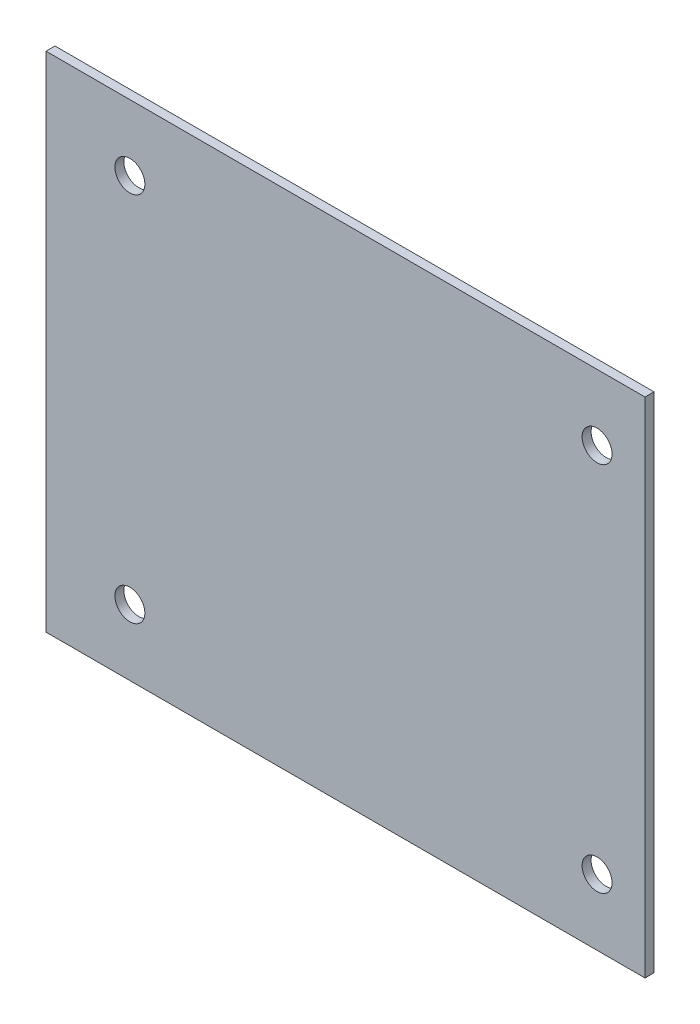
ISO-10303-21;
HEADER;
FILE_DESCRIPTION(('STEP AP214'),'2;1');
FILE_NAME('part.step','',(''),(''),'','','');
FILE_SCHEMA(('AUTOMOTIVE_DESIGN { 1 0 10303 214 1 1 1 1 }'));
ENDSEC;
DATA;
#1=APPLICATION_CONTEXT('core data for automotive mechanical design processes');
#2=APPLICATION_PROTOCOL_DEFINITION('international standard','automotive_design',2000,#1);
#3=PRODUCT_CONTEXT('',#1,'mechanical');
#4=PRODUCT('Part','Part','',(#3));
#5=PRODUCT_RELATED_PRODUCT_CATEGORY('part','',(#4));
#6=PRODUCT_DEFINITION_FORMATION('','',#4);
#7=PRODUCT_DEFINITION_CONTEXT('part definition',#1,'design');
#8=PRODUCT_DEFINITION('design','',#6,#7);
#9=PRODUCT_DEFINITION_SHAPE('','',#8);
#10=(LENGTH_UNIT() NAMED_UNIT(*) SI_UNIT(.MILLI.,.METRE.));
#11=(NAMED_UNIT(*) PLANE_ANGLE_UNIT() SI_UNIT($,.RADIAN.));
#12=(NAMED_UNIT(*) SI_UNIT($,.STERADIAN.) SOLID_ANGLE_UNIT());
#13=UNCERTAINTY_MEASURE_WITH_UNIT(LENGTH_MEASURE(1.E-05),#10,'distance_accuracy_value','');
#14=(GEOMETRIC_REPRESENTATION_CONTEXT(3) GLOBAL_UNCERTAINTY_ASSIGNED_CONTEXT((#13)) GLOBAL_UNIT_ASSIGNED_CONTEXT((#10,
#11,#12)) REPRESENTATION_CONTEXT('',''));
#15=CARTESIAN_POINT('',(0.,0.,0.));
#16=DIRECTION('',(0.,0.,1.));
#17=DIRECTION('',(1.,0.,0.));
#18=AXIS2_PLACEMENT_3D('',#15,#16,#17);
#19=CARTESIAN_POINT('',(-50.,0.,1.5));
#20=DIRECTION('',(-1.,0.,0.));
#21=DIRECTION('',(0.,-1.,0.));
#22=AXIS2_PLACEMENT_3D('',#19,#20,#21);
#23=PLANE('',#22);
#24=DIRECTION('',(0.,1.,0.));
#25=VECTOR('',#24,1.);
#26=CARTESIAN_POINT('',(-50.,0.,0.));
#27=LINE('',#26,#25);
#28=CARTESIAN_POINT('',(-50.,-42.,0.));
#29=VERTEX_POINT('',#28);
#30=CARTESIAN_POINT('',(-50.,42.,0.));
#31=VERTEX_POINT('',#30);
#32=EDGE_CURVE('E137',#29,#31,#27,.T.);
#33=ORIENTED_EDGE('',*,*,#32,.F.);
#34=DIRECTION('',(0.,0.,-1.));
#35=VECTOR('',#34,1.);
#36=CARTESIAN_POINT('',(-50.,-42.,1.5));
#37=LINE('',#36,#35);
#38=CARTESIAN_POINT('',(-50.,-42.,1.5));
#39=VERTEX_POINT('',#38);
#40=EDGE_CURVE('E11',#39,#29,#37,.T.);
#41=ORIENTED_EDGE('',*,*,#40,.F.);
#42=DIRECTION('',(0.,1.,0.));
#43=VECTOR('',#42,1.);
#44=CARTESIAN_POINT('',(-50.,0.,1.5));
#45=LINE('',#44,#43);
#46=CARTESIAN_POINT('',(-50.,42.,1.5));
#47=VERTEX_POINT('',#46);
#48=EDGE_CURVE('E111',#39,#47,#45,.T.);
#49=ORIENTED_EDGE('',*,*,#48,.T.);
#50=DIRECTION('',(0.,0.,-1.));
#51=VECTOR('',#50,1.);
#52=CARTESIAN_POINT('',(-50.,42.,1.5));
#53=LINE('',#52,#51);
#54=EDGE_CURVE('E88',#47,#31,#53,.T.);
#55=ORIENTED_EDGE('',*,*,#54,.T.);
#56=EDGE_LOOP('',(#33,#41,#49,#55));
#57=FACE_BOUND('',#56,.T.);
#58=ADVANCED_FACE('F47',(#57),#23,.T.);
#59=CARTESIAN_POINT('',(0.,-42.,1.5));
#60=DIRECTION('',(0.,-1.,0.));
#61=DIRECTION('',(1.,0.,0.));
#62=AXIS2_PLACEMENT_3D('',#59,#60,#61);
#63=PLANE('',#62);
#64=DIRECTION('',(-1.,0.,0.));
#65=VECTOR('',#64,1.);
#66=CARTESIAN_POINT('',(0.,-42.,0.));
#67=LINE('',#66,#65);
#68=CARTESIAN_POINT('',(50.,-42.,0.));
#69=VERTEX_POINT('',#68);
#70=EDGE_CURVE('E100',#69,#29,#67,.T.);
#71=ORIENTED_EDGE('',*,*,#70,.F.);
#72=DIRECTION('',(0.,0.,-1.));
#73=VECTOR('',#72,1.);
#74=CARTESIAN_POINT('',(50.,-42.,1.5));
#75=LINE('',#74,#73);
#76=CARTESIAN_POINT('',(50.,-42.,1.5));
#77=VERTEX_POINT('',#76);
#78=EDGE_CURVE('E57',#77,#69,#75,.T.);
#79=ORIENTED_EDGE('',*,*,#78,.F.);
#80=DIRECTION('',(-1.,0.,0.));
#81=VECTOR('',#80,1.);
#82=CARTESIAN_POINT('',(0.,-42.,1.5));
#83=LINE('',#82,#81);
#84=EDGE_CURVE('E98',#77,#39,#83,.T.);
#85=ORIENTED_EDGE('',*,*,#84,.T.);
#86=ORIENTED_EDGE('',*,*,#40,.T.);
#87=EDGE_LOOP('',(#71,#79,#85,#86));
#88=FACE_BOUND('',#87,.T.);
#89=ADVANCED_FACE('F96',(#88),#63,.T.);
#90=CARTESIAN_POINT('',(50.,0.,1.5));
#91=DIRECTION('',(-1.,0.,0.));
#92=DIRECTION('',(0.,0.,1.));
#93=AXIS2_PLACEMENT_3D('',#90,#91,#92);
#94=PLANE('',#93);
#95=DIRECTION('',(0.,1.,0.));
#96=VECTOR('',#95,1.);
#97=CARTESIAN_POINT('',(50.,0.,0.));
#98=LINE('',#97,#96);
#99=CARTESIAN_POINT('',(50.,42.,0.));
#100=VERTEX_POINT('',#99);
#101=EDGE_CURVE('E142',#69,#100,#98,.T.);
#102=ORIENTED_EDGE('',*,*,#101,.T.);
#103=DIRECTION('',(0.,0.,-1.));
#104=VECTOR('',#103,1.);
#105=CARTESIAN_POINT('',(50.,42.,1.5));
#106=LINE('',#105,#104);
#107=CARTESIAN_POINT('',(50.,42.,1.5));
#108=VERTEX_POINT('',#107);
#109=EDGE_CURVE('E104',#108,#100,#106,.T.);
#110=ORIENTED_EDGE('',*,*,#109,.F.);
#111=DIRECTION('',(0.,1.,0.));
#112=VECTOR('',#111,1.);
#113=CARTESIAN_POINT('',(50.,0.,1.5));
#114=LINE('',#113,#112);
#115=EDGE_CURVE('E106',#77,#108,#114,.T.);
#116=ORIENTED_EDGE('',*,*,#115,.F.);
#117=ORIENTED_EDGE('',*,*,#78,.T.);
#118=EDGE_LOOP('',(#102,#110,#116,#117));
#119=FACE_BOUND('',#118,.T.);
#120=ADVANCED_FACE('F107',(#119),#94,.F.);
#121=CARTESIAN_POINT('',(42.,-31.,1.5));
#122=DIRECTION('',(0.,0.,-1.));
#123=DIRECTION('',(-1.,0.,0.));
#124=AXIS2_PLACEMENT_3D('',#121,#122,#123);
#125=CYLINDRICAL_SURFACE('',#124,2.5);
#126=CARTESIAN_POINT('',(42.,-31.,1.5));
#127=DIRECTION('',(0.,0.,1.));
#128=DIRECTION('',(1.,0.,0.));
#129=AXIS2_PLACEMENT_3D('',#126,#127,#128);
#130=CIRCLE('',#129,2.5);
#131=CARTESIAN_POINT('',(44.5,-31.,1.5));
#132=VERTEX_POINT('',#131);
#133=EDGE_CURVE('E115',#132,#132,#130,.T.);
#134=ORIENTED_EDGE('',*,*,#133,.T.);
#135=EDGE_LOOP('',(#134));
#136=FACE_BOUND('',#135,.T.);
#137=CARTESIAN_POINT('',(42.,-31.,0.));
#138=DIRECTION('',(0.,0.,1.));
#139=DIRECTION('',(1.,0.,0.));
#140=AXIS2_PLACEMENT_3D('',#137,#138,#139);
#141=CIRCLE('',#140,2.5);
#142=CARTESIAN_POINT('',(44.5,-31.,0.));
#143=VERTEX_POINT('',#142);
#144=EDGE_CURVE('E133',#143,#143,#141,.T.);
#145=ORIENTED_EDGE('',*,*,#144,.F.);
#146=EDGE_LOOP('',(#145));
#147=FACE_BOUND('',#146,.T.);
#148=ADVANCED_FACE('F162',(#136,#147),#125,.F.);
#149=CARTESIAN_POINT('',(42.,31.,1.5));
#150=DIRECTION('',(0.,0.,-1.));
#151=DIRECTION('',(-1.,0.,0.));
#152=AXIS2_PLACEMENT_3D('',#149,#150,#151);
#153=CYLINDRICAL_SURFACE('',#152,2.5);
#154=CARTESIAN_POINT('',(42.,31.,1.5));
#155=DIRECTION('',(0.,0.,1.));
#156=DIRECTION('',(1.,0.,0.));
#157=AXIS2_PLACEMENT_3D('',#154,#155,#156);
#158=CIRCLE('',#157,2.5);
#159=CARTESIAN_POINT('',(44.5,31.,1.5));
#160=VERTEX_POINT('',#159);
#161=EDGE_CURVE('E268',#160,#160,#158,.T.);
#162=ORIENTED_EDGE('',*,*,#161,.T.);
#163=EDGE_LOOP('',(#162));
#164=FACE_BOUND('',#163,.T.);
#165=CARTESIAN_POINT('',(42.,31.,0.));
#166=DIRECTION('',(0.,0.,1.));
#167=DIRECTION('',(1.,0.,0.));
#168=AXIS2_PLACEMENT_3D('',#165,#166,#167);
#169=CIRCLE('',#168,2.5);
#170=CARTESIAN_POINT('',(44.5,31.,0.));
#171=VERTEX_POINT('',#170);
#172=EDGE_CURVE('E129',#171,#171,#169,.T.);
#173=ORIENTED_EDGE('',*,*,#172,.F.);
#174=EDGE_LOOP('',(#173));
#175=FACE_BOUND('',#174,.T.);
#176=ADVANCED_FACE('F165',(#164,#175),#153,.F.);
#177=CARTESIAN_POINT('',(-36.,-31.,1.5));
#178=DIRECTION('',(0.,0.,-1.));
#179=DIRECTION('',(-1.,0.,0.));
#180=AXIS2_PLACEMENT_3D('',#177,#178,#179);
#181=CYLINDRICAL_SURFACE('',#180,2.5);
#182=CARTESIAN_POINT('',(-36.,-31.,1.5));
#183=DIRECTION('',(0.,0.,1.));
#184=DIRECTION('',(1.,0.,0.));
#185=AXIS2_PLACEMENT_3D('',#182,#183,#184);
#186=CIRCLE('',#185,2.5);
#187=CARTESIAN_POINT('',(-33.5,-31.,1.5));
#188=VERTEX_POINT('',#187);
#189=EDGE_CURVE('E179',#188,#188,#186,.T.);
#190=ORIENTED_EDGE('',*,*,#189,.T.);
#191=EDGE_LOOP('',(#190));
#192=FACE_BOUND('',#191,.T.);
#193=CARTESIAN_POINT('',(-36.,-31.,0.));
#194=DIRECTION('',(0.,0.,1.));
#195=DIRECTION('',(1.,0.,0.));
#196=AXIS2_PLACEMENT_3D('',#193,#194,#195);
#197=CIRCLE('',#196,2.5);
#198=CARTESIAN_POINT('',(-33.5,-31.,0.));
#199=VERTEX_POINT('',#198);
#200=EDGE_CURVE('E125',#199,#199,#197,.T.);
#201=ORIENTED_EDGE('',*,*,#200,.F.);
#202=EDGE_LOOP('',(#201));
#203=FACE_BOUND('',#202,.T.);
#204=ADVANCED_FACE('F168',(#192,#203),#181,.F.);
#205=CARTESIAN_POINT('',(-36.,31.,1.5));
#206=DIRECTION('',(0.,0.,-1.));
#207=DIRECTION('',(-1.,0.,0.));
#208=AXIS2_PLACEMENT_3D('',#205,#206,#207);
#209=CYLINDRICAL_SURFACE('',#208,2.5);
#210=CARTESIAN_POINT('',(-36.,31.,1.5));
#211=DIRECTION('',(0.,0.,1.));
#212=DIRECTION('',(1.,0.,0.));
#213=AXIS2_PLACEMENT_3D('',#210,#211,#212);
#214=CIRCLE('',#213,2.5);
#215=CARTESIAN_POINT('',(-33.5,31.,1.5));
#216=VERTEX_POINT('',#215);
#217=EDGE_CURVE('E147',#216,#216,#214,.T.);
#218=ORIENTED_EDGE('',*,*,#217,.T.);
#219=EDGE_LOOP('',(#218));
#220=FACE_BOUND('',#219,.T.);
#221=CARTESIAN_POINT('',(-36.,31.,0.));
#222=DIRECTION('',(0.,0.,1.));
#223=DIRECTION('',(1.,0.,0.));
#224=AXIS2_PLACEMENT_3D('',#221,#222,#223);
#225=CIRCLE('',#224,2.5);
#226=CARTESIAN_POINT('',(-33.5,31.,0.));
#227=VERTEX_POINT('',#226);
#228=EDGE_CURVE('E121',#227,#227,#225,.T.);
#229=ORIENTED_EDGE('',*,*,#228,.F.);
#230=EDGE_LOOP('',(#229));
#231=FACE_BOUND('',#230,.T.);
#232=ADVANCED_FACE('F49',(#220,#231),#209,.F.);
#233=CARTESIAN_POINT('',(0.,42.,1.5));
#234=DIRECTION('',(0.,-1.,0.));
#235=DIRECTION('',(1.,0.,0.));
#236=AXIS2_PLACEMENT_3D('',#233,#234,#235);
#237=PLANE('',#236);
#238=DIRECTION('',(-1.,0.,0.));
#239=VECTOR('',#238,1.);
#240=CARTESIAN_POINT('',(0.,42.,0.));
#241=LINE('',#240,#239);
#242=EDGE_CURVE('E81',#100,#31,#241,.T.);
#243=ORIENTED_EDGE('',*,*,#242,.T.);
#244=ORIENTED_EDGE('',*,*,#54,.F.);
#245=DIRECTION('',(-1.,0.,0.));
#246=VECTOR('',#245,1.);
#247=CARTESIAN_POINT('',(0.,42.,1.5));
#248=LINE('',#247,#246);
#249=EDGE_CURVE('E65',#108,#47,#248,.T.);
#250=ORIENTED_EDGE('',*,*,#249,.F.);
#251=ORIENTED_EDGE('',*,*,#109,.T.);
#252=EDGE_LOOP('',(#243,#244,#250,#251));
#253=FACE_BOUND('',#252,.T.);
#254=ADVANCED_FACE('F152',(#253),#237,.F.);
#255=CARTESIAN_POINT('',(0.,0.,1.5));
#256=DIRECTION('',(0.,0.,1.));
#257=DIRECTION('',(1.,0.,0.));
#258=AXIS2_PLACEMENT_3D('',#255,#256,#257);
#259=PLANE('',#258);
#260=ORIENTED_EDGE('',*,*,#217,.F.);
#261=EDGE_LOOP('',(#260));
#262=FACE_BOUND('',#261,.T.);
#263=ORIENTED_EDGE('',*,*,#189,.F.);
#264=EDGE_LOOP('',(#263));
#265=FACE_BOUND('',#264,.T.);
#266=ORIENTED_EDGE('',*,*,#161,.F.);
#267=EDGE_LOOP('',(#266));
#268=FACE_BOUND('',#267,.T.);
#269=ORIENTED_EDGE('',*,*,#133,.F.);
#270=EDGE_LOOP('',(#269));
#271=FACE_BOUND('',#270,.T.);
#272=ORIENTED_EDGE('',*,*,#48,.F.);
#273=ORIENTED_EDGE('',*,*,#84,.F.);
#274=ORIENTED_EDGE('',*,*,#115,.T.);
#275=ORIENTED_EDGE('',*,*,#249,.T.);
#276=EDGE_LOOP('',(#272,#273,#274,#275));
#277=FACE_BOUND('',#276,.T.);
#278=ADVANCED_FACE('F110',(#262,#265,#268,#271,#277),#259,.T.);
#279=CARTESIAN_POINT('',(0.,0.,0.));
#280=DIRECTION('',(0.,0.,1.));
#281=DIRECTION('',(1.,0.,0.));
#282=AXIS2_PLACEMENT_3D('',#279,#280,#281);
#283=PLANE('',#282);
#284=ORIENTED_EDGE('',*,*,#228,.T.);
#285=EDGE_LOOP('',(#284));
#286=FACE_BOUND('',#285,.T.);
#287=ORIENTED_EDGE('',*,*,#200,.T.);
#288=EDGE_LOOP('',(#287));
#289=FACE_BOUND('',#288,.T.);
#290=ORIENTED_EDGE('',*,*,#172,.T.);
#291=EDGE_LOOP('',(#290));
#292=FACE_BOUND('',#291,.T.);
#293=ORIENTED_EDGE('',*,*,#144,.T.);
#294=EDGE_LOOP('',(#293));
#295=FACE_BOUND('',#294,.T.);
#296=ORIENTED_EDGE('',*,*,#32,.T.);
#297=ORIENTED_EDGE('',*,*,#242,.F.);
#298=ORIENTED_EDGE('',*,*,#101,.F.);
#299=ORIENTED_EDGE('',*,*,#70,.T.);
#300=EDGE_LOOP('',(#296,#297,#298,#299));
#301=FACE_BOUND('',#300,.T.);
#302=ADVANCED_FACE('F153',(#286,#289,#292,#295,#301),#283,.F.);
#303=CLOSED_SHELL('',(#58,#89,#120,#148,#176,#204,#232,#254,#278,#302));
#304=MANIFOLD_SOLID_BREP('B2',#303);
#305=ADVANCED_BREP_SHAPE_REPRESENTATION('',(#18,#304),#14);
#306=SHAPE_DEFINITION_REPRESENTATION(#9,#305);
ENDSEC;
END-ISO-10303-21;
